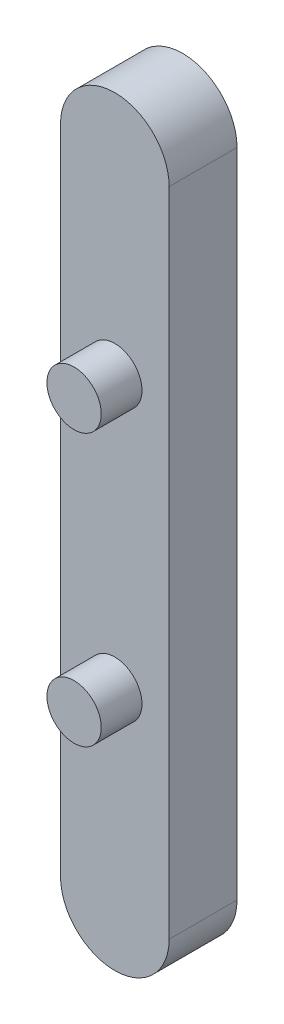
ISO-10303-21;
HEADER;
FILE_DESCRIPTION(('STEP AP214'),'2;1');
FILE_NAME('part.step','',(''),(''),'','','');
FILE_SCHEMA(('AUTOMOTIVE_DESIGN { 1 0 10303 214 1 1 1 1 }'));
ENDSEC;
DATA;
#1=APPLICATION_CONTEXT('core data for automotive mechanical design processes');
#2=APPLICATION_PROTOCOL_DEFINITION('international standard','automotive_design',2000,#1);
#3=PRODUCT_CONTEXT('',#1,'mechanical');
#4=PRODUCT('Part','Part','',(#3));
#5=PRODUCT_RELATED_PRODUCT_CATEGORY('part','',(#4));
#6=PRODUCT_DEFINITION_FORMATION('','',#4);
#7=PRODUCT_DEFINITION_CONTEXT('part definition',#1,'design');
#8=PRODUCT_DEFINITION('design','',#6,#7);
#9=PRODUCT_DEFINITION_SHAPE('','',#8);
#10=(LENGTH_UNIT() NAMED_UNIT(*) SI_UNIT(.MILLI.,.METRE.));
#11=(NAMED_UNIT(*) PLANE_ANGLE_UNIT() SI_UNIT($,.RADIAN.));
#12=(NAMED_UNIT(*) SI_UNIT($,.STERADIAN.) SOLID_ANGLE_UNIT());
#13=UNCERTAINTY_MEASURE_WITH_UNIT(LENGTH_MEASURE(1.E-05),#10,'distance_accuracy_value','');
#14=(GEOMETRIC_REPRESENTATION_CONTEXT(3) GLOBAL_UNCERTAINTY_ASSIGNED_CONTEXT((#13)) GLOBAL_UNIT_ASSIGNED_CONTEXT((#10,
#11,#12)) REPRESENTATION_CONTEXT('',''));
#15=CARTESIAN_POINT('',(0.,0.,0.));
#16=DIRECTION('',(0.,0.,1.));
#17=DIRECTION('',(1.,0.,0.));
#18=AXIS2_PLACEMENT_3D('',#15,#16,#17);
#19=CARTESIAN_POINT('',(0.,0.,2.5));
#20=DIRECTION('',(0.,0.,-1.));
#21=DIRECTION('',(-1.,0.,0.));
#22=AXIS2_PLACEMENT_3D('',#19,#20,#21);
#23=CYLINDRICAL_SURFACE('',#22,2.);
#24=CARTESIAN_POINT('',(0.,0.,0.));
#25=DIRECTION('',(0.,0.,1.));
#26=DIRECTION('',(1.,0.,0.));
#27=AXIS2_PLACEMENT_3D('',#24,#25,#26);
#28=CIRCLE('',#27,2.);
#29=CARTESIAN_POINT('',(-2.,0.,0.));
#30=VERTEX_POINT('',#29);
#31=CARTESIAN_POINT('',(2.,0.,0.));
#32=VERTEX_POINT('',#31);
#33=EDGE_CURVE('E96',#30,#32,#28,.T.);
#34=ORIENTED_EDGE('',*,*,#33,.T.);
#35=DIRECTION('',(0.,0.,-1.));
#36=VECTOR('',#35,1.);
#37=CARTESIAN_POINT('',(2.,0.,2.5));
#38=LINE('',#37,#36);
#39=CARTESIAN_POINT('',(2.,0.,2.5));
#40=VERTEX_POINT('',#39);
#41=EDGE_CURVE('E11',#40,#32,#38,.T.);
#42=ORIENTED_EDGE('',*,*,#41,.F.);
#43=CARTESIAN_POINT('',(0.,0.,2.5));
#44=DIRECTION('',(0.,0.,1.));
#45=DIRECTION('',(1.,0.,0.));
#46=AXIS2_PLACEMENT_3D('',#43,#44,#45);
#47=CIRCLE('',#46,2.);
#48=CARTESIAN_POINT('',(-2.,0.,2.5));
#49=VERTEX_POINT('',#48);
#50=EDGE_CURVE('E84',#49,#40,#47,.T.);
#51=ORIENTED_EDGE('',*,*,#50,.F.);
#52=DIRECTION('',(0.,0.,-1.));
#53=VECTOR('',#52,1.);
#54=CARTESIAN_POINT('',(-2.,0.,2.5));
#55=LINE('',#54,#53);
#56=EDGE_CURVE('E92',#49,#30,#55,.T.);
#57=ORIENTED_EDGE('',*,*,#56,.T.);
#58=EDGE_LOOP('',(#34,#42,#51,#57));
#59=FACE_BOUND('',#58,.T.);
#60=ADVANCED_FACE('F33',(#59),#23,.T.);
#61=CARTESIAN_POINT('',(2.,0.,2.5));
#62=DIRECTION('',(-1.,0.,0.));
#63=DIRECTION('',(0.,-1.,0.));
#64=AXIS2_PLACEMENT_3D('',#61,#62,#63);
#65=PLANE('',#64);
#66=DIRECTION('',(0.,1.,0.));
#67=VECTOR('',#66,1.);
#68=CARTESIAN_POINT('',(2.,0.,0.));
#69=LINE('',#68,#67);
#70=CARTESIAN_POINT('',(2.,24.,0.));
#71=VERTEX_POINT('',#70);
#72=EDGE_CURVE('E88',#32,#71,#69,.T.);
#73=ORIENTED_EDGE('',*,*,#72,.T.);
#74=DIRECTION('',(0.,0.,-1.));
#75=VECTOR('',#74,1.);
#76=CARTESIAN_POINT('',(2.,24.,2.5));
#77=LINE('',#76,#75);
#78=CARTESIAN_POINT('',(2.,24.,2.5));
#79=VERTEX_POINT('',#78);
#80=EDGE_CURVE('E41',#79,#71,#77,.T.);
#81=ORIENTED_EDGE('',*,*,#80,.F.);
#82=DIRECTION('',(0.,1.,0.));
#83=VECTOR('',#82,1.);
#84=CARTESIAN_POINT('',(2.,0.,2.5));
#85=LINE('',#84,#83);
#86=EDGE_CURVE('E79',#40,#79,#85,.T.);
#87=ORIENTED_EDGE('',*,*,#86,.F.);
#88=ORIENTED_EDGE('',*,*,#41,.T.);
#89=EDGE_LOOP('',(#73,#81,#87,#88));
#90=FACE_BOUND('',#89,.T.);
#91=ADVANCED_FACE('F87',(#90),#65,.F.);
#92=CARTESIAN_POINT('',(0.,24.,2.5));
#93=DIRECTION('',(0.,0.,-1.));
#94=DIRECTION('',(-1.,0.,0.));
#95=AXIS2_PLACEMENT_3D('',#92,#93,#94);
#96=CYLINDRICAL_SURFACE('',#95,2.);
#97=CARTESIAN_POINT('',(0.,24.,0.));
#98=DIRECTION('',(0.,0.,1.));
#99=DIRECTION('',(1.,0.,0.));
#100=AXIS2_PLACEMENT_3D('',#97,#98,#99);
#101=CIRCLE('',#100,2.);
#102=CARTESIAN_POINT('',(-2.,24.,0.));
#103=VERTEX_POINT('',#102);
#104=EDGE_CURVE('E66',#71,#103,#101,.T.);
#105=ORIENTED_EDGE('',*,*,#104,.T.);
#106=DIRECTION('',(0.,0.,-1.));
#107=VECTOR('',#106,1.);
#108=CARTESIAN_POINT('',(-2.,24.,2.5));
#109=LINE('',#108,#107);
#110=CARTESIAN_POINT('',(-2.,24.,2.5));
#111=VERTEX_POINT('',#110);
#112=EDGE_CURVE('E89',#111,#103,#109,.T.);
#113=ORIENTED_EDGE('',*,*,#112,.F.);
#114=CARTESIAN_POINT('',(0.,24.,2.5));
#115=DIRECTION('',(0.,0.,1.));
#116=DIRECTION('',(1.,0.,0.));
#117=AXIS2_PLACEMENT_3D('',#114,#115,#116);
#118=CIRCLE('',#117,2.);
#119=EDGE_CURVE('E82',#79,#111,#118,.T.);
#120=ORIENTED_EDGE('',*,*,#119,.F.);
#121=ORIENTED_EDGE('',*,*,#80,.T.);
#122=EDGE_LOOP('',(#105,#113,#120,#121));
#123=FACE_BOUND('',#122,.T.);
#124=ADVANCED_FACE('F90',(#123),#96,.T.);
#125=CARTESIAN_POINT('',(-2.,0.,2.5));
#126=DIRECTION('',(1.,0.,0.));
#127=DIRECTION('',(0.,1.,0.));
#128=AXIS2_PLACEMENT_3D('',#125,#126,#127);
#129=PLANE('',#128);
#130=DIRECTION('',(0.,-1.,0.));
#131=VECTOR('',#130,1.);
#132=CARTESIAN_POINT('',(-2.,0.,0.));
#133=LINE('',#132,#131);
#134=EDGE_CURVE('E72',#103,#30,#133,.T.);
#135=ORIENTED_EDGE('',*,*,#134,.T.);
#136=ORIENTED_EDGE('',*,*,#56,.F.);
#137=DIRECTION('',(0.,-1.,0.));
#138=VECTOR('',#137,1.);
#139=CARTESIAN_POINT('',(-2.,0.,2.5));
#140=LINE('',#139,#138);
#141=EDGE_CURVE('E49',#111,#49,#140,.T.);
#142=ORIENTED_EDGE('',*,*,#141,.F.);
#143=ORIENTED_EDGE('',*,*,#112,.T.);
#144=EDGE_LOOP('',(#135,#136,#142,#143));
#145=FACE_BOUND('',#144,.T.);
#146=ADVANCED_FACE('F104',(#145),#129,.F.);
#147=CARTESIAN_POINT('',(0.,0.,2.5));
#148=DIRECTION('',(0.,0.,1.));
#149=DIRECTION('',(1.,0.,0.));
#150=AXIS2_PLACEMENT_3D('',#147,#148,#149);
#151=PLANE('',#150);
#152=CARTESIAN_POINT('',(0.,7.,2.5));
#153=DIRECTION('',(0.,0.,1.));
#154=DIRECTION('',(1.,0.,0.));
#155=AXIS2_PLACEMENT_3D('',#152,#153,#154);
#156=CIRCLE('',#155,1.);
#157=CARTESIAN_POINT('',(1.,7.,2.5));
#158=VERTEX_POINT('',#157);
#159=EDGE_CURVE('E116',#158,#158,#156,.T.);
#160=ORIENTED_EDGE('',*,*,#159,.F.);
#161=EDGE_LOOP('',(#160));
#162=FACE_BOUND('',#161,.T.);
#163=CARTESIAN_POINT('',(0.,17.,2.5));
#164=DIRECTION('',(0.,0.,1.));
#165=DIRECTION('',(1.,0.,0.));
#166=AXIS2_PLACEMENT_3D('',#163,#164,#165);
#167=CIRCLE('',#166,1.);
#168=CARTESIAN_POINT('',(1.00000000000001,17.,2.5));
#169=VERTEX_POINT('',#168);
#170=EDGE_CURVE('E110',#169,#169,#167,.T.);
#171=ORIENTED_EDGE('',*,*,#170,.F.);
#172=EDGE_LOOP('',(#171));
#173=FACE_BOUND('',#172,.T.);
#174=ORIENTED_EDGE('',*,*,#50,.T.);
#175=ORIENTED_EDGE('',*,*,#86,.T.);
#176=ORIENTED_EDGE('',*,*,#119,.T.);
#177=ORIENTED_EDGE('',*,*,#141,.T.);
#178=EDGE_LOOP('',(#174,#175,#176,#177));
#179=FACE_BOUND('',#178,.T.);
#180=ADVANCED_FACE('F80',(#162,#173,#179),#151,.T.);
#181=CARTESIAN_POINT('',(0.,0.,0.));
#182=DIRECTION('',(0.,0.,1.));
#183=DIRECTION('',(1.,0.,0.));
#184=AXIS2_PLACEMENT_3D('',#181,#182,#183);
#185=PLANE('',#184);
#186=ORIENTED_EDGE('',*,*,#33,.F.);
#187=ORIENTED_EDGE('',*,*,#134,.F.);
#188=ORIENTED_EDGE('',*,*,#104,.F.);
#189=ORIENTED_EDGE('',*,*,#72,.F.);
#190=EDGE_LOOP('',(#186,#187,#188,#189));
#191=FACE_BOUND('',#190,.T.);
#192=ADVANCED_FACE('F107',(#191),#185,.F.);
#193=CARTESIAN_POINT('',(0.,17.,4.));
#194=DIRECTION('',(0.,0.,-1.));
#195=DIRECTION('',(-1.,0.,0.));
#196=AXIS2_PLACEMENT_3D('',#193,#194,#195);
#197=CYLINDRICAL_SURFACE('',#196,1.);
#198=CARTESIAN_POINT('',(0.,17.,4.));
#199=DIRECTION('',(0.,0.,1.));
#200=DIRECTION('',(1.,0.,0.));
#201=AXIS2_PLACEMENT_3D('',#198,#199,#200);
#202=CIRCLE('',#201,1.);
#203=CARTESIAN_POINT('',(1.00000000000001,17.,4.));
#204=VERTEX_POINT('',#203);
#205=EDGE_CURVE('E99',#204,#204,#202,.T.);
#206=ORIENTED_EDGE('',*,*,#205,.F.);
#207=EDGE_LOOP('',(#206));
#208=FACE_BOUND('',#207,.T.);
#209=ORIENTED_EDGE('',*,*,#170,.T.);
#210=EDGE_LOOP('',(#209));
#211=FACE_BOUND('',#210,.T.);
#212=ADVANCED_FACE('F136',(#208,#211),#197,.T.);
#213=CARTESIAN_POINT('',(0.,17.,4.));
#214=DIRECTION('',(0.,0.,1.));
#215=DIRECTION('',(1.,0.,0.));
#216=AXIS2_PLACEMENT_3D('',#213,#214,#215);
#217=PLANE('',#216);
#218=ORIENTED_EDGE('',*,*,#205,.T.);
#219=EDGE_LOOP('',(#218));
#220=FACE_BOUND('',#219,.T.);
#221=ADVANCED_FACE('F127',(#220),#217,.T.);
#222=CARTESIAN_POINT('',(0.,7.,4.));
#223=DIRECTION('',(0.,0.,-1.));
#224=DIRECTION('',(-1.,0.,0.));
#225=AXIS2_PLACEMENT_3D('',#222,#223,#224);
#226=CYLINDRICAL_SURFACE('',#225,1.);
#227=CARTESIAN_POINT('',(0.,7.,4.));
#228=DIRECTION('',(0.,0.,1.));
#229=DIRECTION('',(1.,0.,0.));
#230=AXIS2_PLACEMENT_3D('',#227,#228,#229);
#231=CIRCLE('',#230,1.);
#232=CARTESIAN_POINT('',(1.,7.,4.));
#233=VERTEX_POINT('',#232);
#234=EDGE_CURVE('E113',#233,#233,#231,.T.);
#235=ORIENTED_EDGE('',*,*,#234,.F.);
#236=EDGE_LOOP('',(#235));
#237=FACE_BOUND('',#236,.T.);
#238=ORIENTED_EDGE('',*,*,#159,.T.);
#239=EDGE_LOOP('',(#238));
#240=FACE_BOUND('',#239,.T.);
#241=ADVANCED_FACE('F124',(#237,#240),#226,.T.);
#242=CARTESIAN_POINT('',(0.,7.,4.));
#243=DIRECTION('',(0.,0.,1.));
#244=DIRECTION('',(1.,0.,0.));
#245=AXIS2_PLACEMENT_3D('',#242,#243,#244);
#246=PLANE('',#245);
#247=ORIENTED_EDGE('',*,*,#234,.T.);
#248=EDGE_LOOP('',(#247));
#249=FACE_BOUND('',#248,.T.);
#250=ADVANCED_FACE('F122',(#249),#246,.T.);
#251=CLOSED_SHELL('',(#60,#91,#124,#146,#180,#192,#212,#221,#241,#250));
#252=MANIFOLD_SOLID_BREP('B2',#251);
#253=ADVANCED_BREP_SHAPE_REPRESENTATION('',(#18,#252),#14);
#254=SHAPE_DEFINITION_REPRESENTATION(#9,#253);
ENDSEC;
END-ISO-10303-21;
